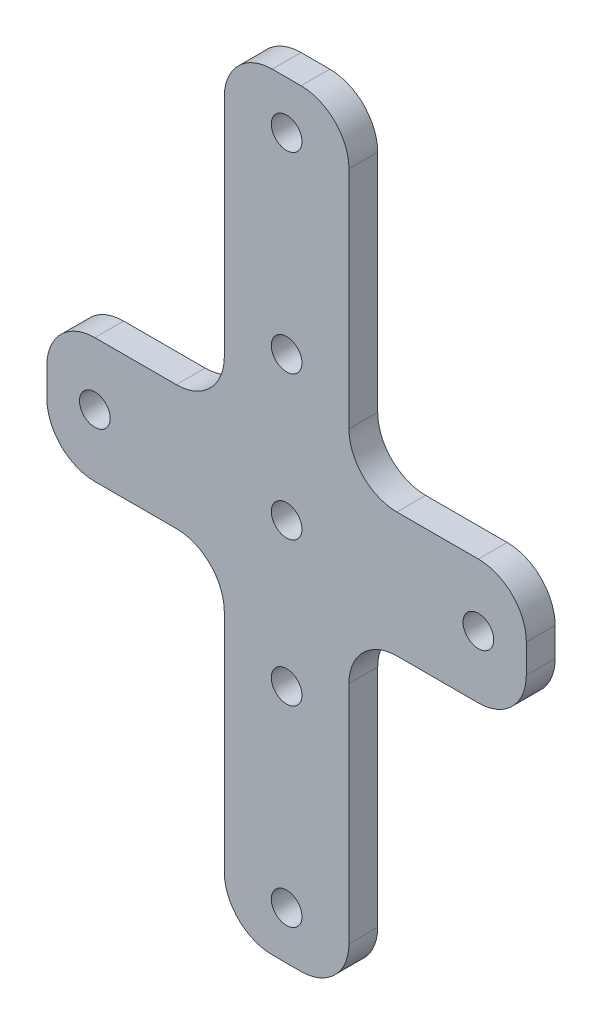
ISO-10303-21;
HEADER;
FILE_DESCRIPTION(('STEP AP214'),'2;1');
FILE_NAME('part.step','',(''),(''),'','','');
FILE_SCHEMA(('AUTOMOTIVE_DESIGN { 1 0 10303 214 1 1 1 1 }'));
ENDSEC;
DATA;
#1=APPLICATION_CONTEXT('core data for automotive mechanical design processes');
#2=APPLICATION_PROTOCOL_DEFINITION('international standard','automotive_design',2000,#1);
#3=PRODUCT_CONTEXT('',#1,'mechanical');
#4=PRODUCT('Part','Part','',(#3));
#5=PRODUCT_RELATED_PRODUCT_CATEGORY('part','',(#4));
#6=PRODUCT_DEFINITION_FORMATION('','',#4);
#7=PRODUCT_DEFINITION_CONTEXT('part definition',#1,'design');
#8=PRODUCT_DEFINITION('design','',#6,#7);
#9=PRODUCT_DEFINITION_SHAPE('','',#8);
#10=(LENGTH_UNIT() NAMED_UNIT(*) SI_UNIT(.MILLI.,.METRE.));
#11=(NAMED_UNIT(*) PLANE_ANGLE_UNIT() SI_UNIT($,.RADIAN.));
#12=(NAMED_UNIT(*) SI_UNIT($,.STERADIAN.) SOLID_ANGLE_UNIT());
#13=UNCERTAINTY_MEASURE_WITH_UNIT(LENGTH_MEASURE(1.E-05),#10,'distance_accuracy_value','');
#14=(GEOMETRIC_REPRESENTATION_CONTEXT(3) GLOBAL_UNCERTAINTY_ASSIGNED_CONTEXT((#13)) GLOBAL_UNIT_ASSIGNED_CONTEXT((#10,
#11,#12)) REPRESENTATION_CONTEXT('',''));
#15=CARTESIAN_POINT('',(0.,0.,0.));
#16=DIRECTION('',(0.,0.,1.));
#17=DIRECTION('',(1.,0.,0.));
#18=AXIS2_PLACEMENT_3D('',#15,#16,#17);
#19=CARTESIAN_POINT('',(-25.,-6.50000000000001,3.));
#20=DIRECTION('',(0.,1.,0.));
#21=DIRECTION('',(0.,0.,1.));
#22=AXIS2_PLACEMENT_3D('',#19,#20,#21);
#23=PLANE('',#22);
#24=DIRECTION('',(0.,0.,-1.));
#25=VECTOR('',#24,1.);
#26=CARTESIAN_POINT('',(11.5,-6.5,3.));
#27=LINE('',#26,#25);
#28=CARTESIAN_POINT('',(11.5,-6.50000000000001,0.));
#29=VERTEX_POINT('',#28);
#30=CARTESIAN_POINT('',(11.5,-6.5,3.));
#31=VERTEX_POINT('',#30);
#32=EDGE_CURVE('E69',#29,#31,#27,.F.);
#33=ORIENTED_EDGE('',*,*,#32,.F.);
#34=DIRECTION('',(1.,0.,0.));
#35=VECTOR('',#34,1.);
#36=CARTESIAN_POINT('',(-25.,-6.50000000000001,0.));
#37=LINE('',#36,#35);
#38=CARTESIAN_POINT('',(20.,-6.50000000000001,0.));
#39=VERTEX_POINT('',#38);
#40=EDGE_CURVE('E382',#29,#39,#37,.T.);
#41=ORIENTED_EDGE('',*,*,#40,.T.);
#42=DIRECTION('',(0.,0.,-1.));
#43=VECTOR('',#42,1.);
#44=CARTESIAN_POINT('',(20.,-6.50000000000001,3.));
#45=LINE('',#44,#43);
#46=CARTESIAN_POINT('',(20.,-6.50000000000001,3.));
#47=VERTEX_POINT('',#46);
#48=EDGE_CURVE('E476',#39,#47,#45,.F.);
#49=ORIENTED_EDGE('',*,*,#48,.T.);
#50=DIRECTION('',(1.,0.,0.));
#51=VECTOR('',#50,1.);
#52=CARTESIAN_POINT('',(-25.,-6.50000000000001,3.));
#53=LINE('',#52,#51);
#54=EDGE_CURVE('E350',#31,#47,#53,.T.);
#55=ORIENTED_EDGE('',*,*,#54,.F.);
#56=EDGE_LOOP('',(#33,#41,#49,#55));
#57=FACE_BOUND('',#56,.T.);
#58=ADVANCED_FACE('F45',(#57),#23,.F.);
#59=CARTESIAN_POINT('',(0.,0.,3.));
#60=DIRECTION('',(0.,0.,-1.));
#61=DIRECTION('',(-1.,0.,0.));
#62=AXIS2_PLACEMENT_3D('',#59,#60,#61);
#63=PLANE('',#62);
#64=DIRECTION('',(-1.,0.,0.));
#65=VECTOR('',#64,1.);
#66=CARTESIAN_POINT('',(25.,6.5,3.));
#67=LINE('',#66,#65);
#68=CARTESIAN_POINT('',(20.,6.5,3.));
#69=VERTEX_POINT('',#68);
#70=CARTESIAN_POINT('',(11.5,6.5,3.));
#71=VERTEX_POINT('',#70);
#72=EDGE_CURVE('E358',#69,#71,#67,.T.);
#73=ORIENTED_EDGE('',*,*,#72,.T.);
#74=CARTESIAN_POINT('',(11.5,11.5,3.));
#75=DIRECTION('',(0.,0.,-1.));
#76=DIRECTION('',(-1.,0.,0.));
#77=AXIS2_PLACEMENT_3D('',#74,#75,#76);
#78=CIRCLE('',#77,5.);
#79=CARTESIAN_POINT('',(6.5,11.5,3.));
#80=VERTEX_POINT('',#79);
#81=EDGE_CURVE('E11',#71,#80,#78,.T.);
#82=ORIENTED_EDGE('',*,*,#81,.T.);
#83=DIRECTION('',(0.,1.,0.));
#84=VECTOR('',#83,1.);
#85=CARTESIAN_POINT('',(6.5,6.5,3.));
#86=LINE('',#85,#84);
#87=CARTESIAN_POINT('',(6.5,35.,3.));
#88=VERTEX_POINT('',#87);
#89=EDGE_CURVE('E362',#80,#88,#86,.T.);
#90=ORIENTED_EDGE('',*,*,#89,.T.);
#91=CARTESIAN_POINT('',(1.5,35.,3.));
#92=DIRECTION('',(0.,0.,-1.));
#93=DIRECTION('',(-1.,0.,0.));
#94=AXIS2_PLACEMENT_3D('',#91,#92,#93);
#95=CIRCLE('',#94,5.);
#96=CARTESIAN_POINT('',(1.5,40.,3.));
#97=VERTEX_POINT('',#96);
#98=EDGE_CURVE('E445',#88,#97,#95,.F.);
#99=ORIENTED_EDGE('',*,*,#98,.T.);
#100=DIRECTION('',(-1.,0.,0.));
#101=VECTOR('',#100,1.);
#102=CARTESIAN_POINT('',(6.5,40.,3.));
#103=LINE('',#102,#101);
#104=CARTESIAN_POINT('',(-1.5,40.,3.));
#105=VERTEX_POINT('',#104);
#106=EDGE_CURVE('E366',#97,#105,#103,.T.);
#107=ORIENTED_EDGE('',*,*,#106,.T.);
#108=CARTESIAN_POINT('',(-1.5,35.,3.));
#109=DIRECTION('',(0.,0.,-1.));
#110=DIRECTION('',(-1.,0.,0.));
#111=AXIS2_PLACEMENT_3D('',#108,#109,#110);
#112=CIRCLE('',#111,5.);
#113=CARTESIAN_POINT('',(-6.5,35.,3.));
#114=VERTEX_POINT('',#113);
#115=EDGE_CURVE('E448',#105,#114,#112,.F.);
#116=ORIENTED_EDGE('',*,*,#115,.T.);
#117=DIRECTION('',(0.,-1.,0.));
#118=VECTOR('',#117,1.);
#119=CARTESIAN_POINT('',(-6.5,40.,3.));
#120=LINE('',#119,#118);
#121=CARTESIAN_POINT('',(-6.5,11.5,3.));
#122=VERTEX_POINT('',#121);
#123=EDGE_CURVE('E337',#114,#122,#120,.T.);
#124=ORIENTED_EDGE('',*,*,#123,.T.);
#125=CARTESIAN_POINT('',(-11.5,11.5,3.));
#126=DIRECTION('',(0.,0.,-1.));
#127=DIRECTION('',(-1.,0.,0.));
#128=AXIS2_PLACEMENT_3D('',#125,#126,#127);
#129=CIRCLE('',#128,5.);
#130=CARTESIAN_POINT('',(-11.5,6.5,3.));
#131=VERTEX_POINT('',#130);
#132=EDGE_CURVE('E497',#122,#131,#129,.T.);
#133=ORIENTED_EDGE('',*,*,#132,.T.);
#134=DIRECTION('',(-1.,0.,0.));
#135=VECTOR('',#134,1.);
#136=CARTESIAN_POINT('',(-6.5,6.5,3.));
#137=LINE('',#136,#135);
#138=CARTESIAN_POINT('',(-20.,6.49999999999999,3.));
#139=VERTEX_POINT('',#138);
#140=EDGE_CURVE('E341',#131,#139,#137,.T.);
#141=ORIENTED_EDGE('',*,*,#140,.T.);
#142=CARTESIAN_POINT('',(-20.,1.49999999999999,3.));
#143=DIRECTION('',(0.,0.,-1.));
#144=DIRECTION('',(-1.,0.,0.));
#145=AXIS2_PLACEMENT_3D('',#142,#143,#144);
#146=CIRCLE('',#145,5.);
#147=CARTESIAN_POINT('',(-25.,1.49999999999999,3.));
#148=VERTEX_POINT('',#147);
#149=EDGE_CURVE('E433',#139,#148,#146,.F.);
#150=ORIENTED_EDGE('',*,*,#149,.T.);
#151=DIRECTION('',(0.,-1.,0.));
#152=VECTOR('',#151,1.);
#153=CARTESIAN_POINT('',(-25.,6.49999999999999,3.));
#154=LINE('',#153,#152);
#155=CARTESIAN_POINT('',(-25.,-1.5,3.));
#156=VERTEX_POINT('',#155);
#157=EDGE_CURVE('E346',#148,#156,#154,.T.);
#158=ORIENTED_EDGE('',*,*,#157,.T.);
#159=CARTESIAN_POINT('',(-20.,-1.5,3.));
#160=DIRECTION('',(0.,0.,-1.));
#161=DIRECTION('',(-1.,0.,0.));
#162=AXIS2_PLACEMENT_3D('',#159,#160,#161);
#163=CIRCLE('',#162,5.);
#164=CARTESIAN_POINT('',(-20.,-6.50000000000001,3.));
#165=VERTEX_POINT('',#164);
#166=EDGE_CURVE('E436',#156,#165,#163,.F.);
#167=ORIENTED_EDGE('',*,*,#166,.T.);
#168=CARTESIAN_POINT('',(-11.5,-6.50000000000001,3.));
#169=VERTEX_POINT('',#168);
#170=EDGE_CURVE('E351',#165,#169,#53,.T.);
#171=ORIENTED_EDGE('',*,*,#170,.T.);
#172=CARTESIAN_POINT('',(-11.5,-11.5,3.));
#173=DIRECTION('',(0.,0.,1.));
#174=DIRECTION('',(-1.,0.,0.));
#175=AXIS2_PLACEMENT_3D('',#172,#173,#174);
#176=CIRCLE('',#175,5.);
#177=CARTESIAN_POINT('',(-6.5,-11.5,3.));
#178=VERTEX_POINT('',#177);
#179=EDGE_CURVE('E284',#178,#169,#176,.T.);
#180=ORIENTED_EDGE('',*,*,#179,.F.);
#181=DIRECTION('',(0.,1.,0.));
#182=VECTOR('',#181,1.);
#183=CARTESIAN_POINT('',(-6.5,-40.,3.));
#184=LINE('',#183,#182);
#185=CARTESIAN_POINT('',(-6.5,-35.,3.));
#186=VERTEX_POINT('',#185);
#187=EDGE_CURVE('E254',#186,#178,#184,.T.);
#188=ORIENTED_EDGE('',*,*,#187,.F.);
#189=CARTESIAN_POINT('',(-1.5,-35.,3.));
#190=DIRECTION('',(0.,0.,1.));
#191=DIRECTION('',(-1.,0.,0.));
#192=AXIS2_PLACEMENT_3D('',#189,#190,#191);
#193=CIRCLE('',#192,5.);
#194=CARTESIAN_POINT('',(-1.5,-40.,3.));
#195=VERTEX_POINT('',#194);
#196=EDGE_CURVE('E213',#195,#186,#193,.F.);
#197=ORIENTED_EDGE('',*,*,#196,.F.);
#198=DIRECTION('',(-1.,0.,0.));
#199=VECTOR('',#198,1.);
#200=CARTESIAN_POINT('',(6.5,-40.,3.));
#201=LINE('',#200,#199);
#202=CARTESIAN_POINT('',(1.5,-40.,3.));
#203=VERTEX_POINT('',#202);
#204=EDGE_CURVE('E249',#203,#195,#201,.T.);
#205=ORIENTED_EDGE('',*,*,#204,.F.);
#206=CARTESIAN_POINT('',(1.5,-35.,3.));
#207=DIRECTION('',(0.,0.,1.));
#208=DIRECTION('',(-1.,0.,0.));
#209=AXIS2_PLACEMENT_3D('',#206,#207,#208);
#210=CIRCLE('',#209,5.);
#211=CARTESIAN_POINT('',(6.5,-35.,3.));
#212=VERTEX_POINT('',#211);
#213=EDGE_CURVE('E265',#212,#203,#210,.F.);
#214=ORIENTED_EDGE('',*,*,#213,.F.);
#215=DIRECTION('',(0.,-1.,0.));
#216=VECTOR('',#215,1.);
#217=CARTESIAN_POINT('',(6.5,-6.5,3.));
#218=LINE('',#217,#216);
#219=CARTESIAN_POINT('',(6.5,-11.5,3.));
#220=VERTEX_POINT('',#219);
#221=EDGE_CURVE('E564',#220,#212,#218,.T.);
#222=ORIENTED_EDGE('',*,*,#221,.F.);
#223=CARTESIAN_POINT('',(11.5,-11.5,3.));
#224=DIRECTION('',(0.,0.,1.));
#225=DIRECTION('',(-1.,0.,0.));
#226=AXIS2_PLACEMENT_3D('',#223,#224,#225);
#227=CIRCLE('',#226,5.);
#228=EDGE_CURVE('E292',#31,#220,#227,.T.);
#229=ORIENTED_EDGE('',*,*,#228,.F.);
#230=ORIENTED_EDGE('',*,*,#54,.T.);
#231=CARTESIAN_POINT('',(20.,-1.5,3.));
#232=DIRECTION('',(0.,0.,-1.));
#233=DIRECTION('',(-1.,0.,0.));
#234=AXIS2_PLACEMENT_3D('',#231,#232,#233);
#235=CIRCLE('',#234,5.);
#236=CARTESIAN_POINT('',(25.,-1.50000000000001,3.));
#237=VERTEX_POINT('',#236);
#238=EDGE_CURVE('E439',#47,#237,#235,.F.);
#239=ORIENTED_EDGE('',*,*,#238,.T.);
#240=DIRECTION('',(0.,1.,0.));
#241=VECTOR('',#240,1.);
#242=CARTESIAN_POINT('',(25.,-6.50000000000001,3.));
#243=LINE('',#242,#241);
#244=CARTESIAN_POINT('',(25.,1.5,3.));
#245=VERTEX_POINT('',#244);
#246=EDGE_CURVE('E354',#237,#245,#243,.T.);
#247=ORIENTED_EDGE('',*,*,#246,.T.);
#248=CARTESIAN_POINT('',(20.,1.5,3.));
#249=DIRECTION('',(0.,0.,-1.));
#250=DIRECTION('',(-1.,0.,0.));
#251=AXIS2_PLACEMENT_3D('',#248,#249,#250);
#252=CIRCLE('',#251,5.);
#253=EDGE_CURVE('E442',#245,#69,#252,.F.);
#254=ORIENTED_EDGE('',*,*,#253,.T.);
#255=EDGE_LOOP('',(#73,#82,#90,#99,#107,#116,#124,#133,#141,#150,#158,#167,#171,#180,#188,#197,
#205,#214,#222,#229,#230,#239,#247,#254));
#256=FACE_BOUND('',#255,.T.);
#257=CARTESIAN_POINT('',(0.,0.,3.));
#258=DIRECTION('',(0.,0.,1.));
#259=DIRECTION('',(1.,0.,0.));
#260=AXIS2_PLACEMENT_3D('',#257,#258,#259);
#261=CIRCLE('',#260,1.6);
#262=CARTESIAN_POINT('',(1.6,0.,3.));
#263=VERTEX_POINT('',#262);
#264=EDGE_CURVE('E313',#263,#263,#261,.T.);
#265=ORIENTED_EDGE('',*,*,#264,.F.);
#266=EDGE_LOOP('',(#265));
#267=FACE_BOUND('',#266,.T.);
#268=CARTESIAN_POINT('',(20.,0.,3.));
#269=DIRECTION('',(0.,0.,1.));
#270=DIRECTION('',(1.,0.,0.));
#271=AXIS2_PLACEMENT_3D('',#268,#269,#270);
#272=CIRCLE('',#271,1.6);
#273=CARTESIAN_POINT('',(21.6,0.,3.));
#274=VERTEX_POINT('',#273);
#275=EDGE_CURVE('E305',#274,#274,#272,.T.);
#276=ORIENTED_EDGE('',*,*,#275,.F.);
#277=EDGE_LOOP('',(#276));
#278=FACE_BOUND('',#277,.T.);
#279=CARTESIAN_POINT('',(-20.,0.,3.));
#280=DIRECTION('',(0.,0.,1.));
#281=DIRECTION('',(1.,0.,0.));
#282=AXIS2_PLACEMENT_3D('',#279,#280,#281);
#283=CIRCLE('',#282,1.6);
#284=CARTESIAN_POINT('',(-18.4,0.,3.));
#285=VERTEX_POINT('',#284);
#286=EDGE_CURVE('E297',#285,#285,#283,.T.);
#287=ORIENTED_EDGE('',*,*,#286,.F.);
#288=EDGE_LOOP('',(#287));
#289=FACE_BOUND('',#288,.T.);
#290=CARTESIAN_POINT('',(0.,-15.,3.));
#291=DIRECTION('',(0.,0.,-1.));
#292=DIRECTION('',(1.,0.,0.));
#293=AXIS2_PLACEMENT_3D('',#290,#291,#292);
#294=CIRCLE('',#293,1.6);
#295=CARTESIAN_POINT('',(1.6,-15.,3.));
#296=VERTEX_POINT('',#295);
#297=EDGE_CURVE('E571',#296,#296,#294,.T.);
#298=ORIENTED_EDGE('',*,*,#297,.T.);
#299=EDGE_LOOP('',(#298));
#300=FACE_BOUND('',#299,.T.);
#301=CARTESIAN_POINT('',(0.,-35.,3.));
#302=DIRECTION('',(0.,0.,-1.));
#303=DIRECTION('',(1.,0.,0.));
#304=AXIS2_PLACEMENT_3D('',#301,#302,#303);
#305=CIRCLE('',#304,1.6);
#306=CARTESIAN_POINT('',(1.6,-35.,3.));
#307=VERTEX_POINT('',#306);
#308=EDGE_CURVE('E239',#307,#307,#305,.T.);
#309=ORIENTED_EDGE('',*,*,#308,.T.);
#310=EDGE_LOOP('',(#309));
#311=FACE_BOUND('',#310,.T.);
#312=CARTESIAN_POINT('',(0.,15.,3.));
#313=DIRECTION('',(0.,0.,1.));
#314=DIRECTION('',(1.,0.,0.));
#315=AXIS2_PLACEMENT_3D('',#312,#313,#314);
#316=CIRCLE('',#315,1.6);
#317=CARTESIAN_POINT('',(1.6,15.,3.));
#318=VERTEX_POINT('',#317);
#319=EDGE_CURVE('E321',#318,#318,#316,.T.);
#320=ORIENTED_EDGE('',*,*,#319,.F.);
#321=EDGE_LOOP('',(#320));
#322=FACE_BOUND('',#321,.T.);
#323=CARTESIAN_POINT('',(0.,35.,3.));
#324=DIRECTION('',(0.,0.,1.));
#325=DIRECTION('',(1.,0.,0.));
#326=AXIS2_PLACEMENT_3D('',#323,#324,#325);
#327=CIRCLE('',#326,1.6);
#328=CARTESIAN_POINT('',(1.6,35.,3.));
#329=VERTEX_POINT('',#328);
#330=EDGE_CURVE('E329',#329,#329,#327,.T.);
#331=ORIENTED_EDGE('',*,*,#330,.F.);
#332=EDGE_LOOP('',(#331));
#333=FACE_BOUND('',#332,.T.);
#334=ADVANCED_FACE('F512',(#256,#267,#278,#289,#300,#311,#322,#333),#63,.F.);
#335=CARTESIAN_POINT('',(0.,0.,0.));
#336=DIRECTION('',(0.,0.,-1.));
#337=DIRECTION('',(-1.,0.,0.));
#338=AXIS2_PLACEMENT_3D('',#335,#336,#337);
#339=PLANE('',#338);
#340=DIRECTION('',(-1.,0.,0.));
#341=VECTOR('',#340,1.);
#342=CARTESIAN_POINT('',(-6.5,6.5,0.));
#343=LINE('',#342,#341);
#344=CARTESIAN_POINT('',(-11.5,6.5,0.));
#345=VERTEX_POINT('',#344);
#346=CARTESIAN_POINT('',(-20.,6.49999999999999,0.));
#347=VERTEX_POINT('',#346);
#348=EDGE_CURVE('E374',#345,#347,#343,.T.);
#349=ORIENTED_EDGE('',*,*,#348,.F.);
#350=CARTESIAN_POINT('',(-11.5,11.5,0.));
#351=DIRECTION('',(0.,0.,-1.));
#352=DIRECTION('',(-1.,0.,0.));
#353=AXIS2_PLACEMENT_3D('',#350,#351,#352);
#354=CIRCLE('',#353,5.);
#355=CARTESIAN_POINT('',(-6.5,11.5,0.));
#356=VERTEX_POINT('',#355);
#357=EDGE_CURVE('E494',#345,#356,#354,.F.);
#358=ORIENTED_EDGE('',*,*,#357,.T.);
#359=DIRECTION('',(0.,-1.,0.));
#360=VECTOR('',#359,1.);
#361=CARTESIAN_POINT('',(-6.5,40.,0.));
#362=LINE('',#361,#360);
#363=CARTESIAN_POINT('',(-6.5,35.,0.));
#364=VERTEX_POINT('',#363);
#365=EDGE_CURVE('E333',#364,#356,#362,.T.);
#366=ORIENTED_EDGE('',*,*,#365,.F.);
#367=CARTESIAN_POINT('',(-1.5,35.,0.));
#368=DIRECTION('',(0.,0.,-1.));
#369=DIRECTION('',(-1.,0.,0.));
#370=AXIS2_PLACEMENT_3D('',#367,#368,#369);
#371=CIRCLE('',#370,5.);
#372=CARTESIAN_POINT('',(-1.5,40.,0.));
#373=VERTEX_POINT('',#372);
#374=EDGE_CURVE('E423',#364,#373,#371,.T.);
#375=ORIENTED_EDGE('',*,*,#374,.T.);
#376=DIRECTION('',(-1.,0.,0.));
#377=VECTOR('',#376,1.);
#378=CARTESIAN_POINT('',(6.5,40.,0.));
#379=LINE('',#378,#377);
#380=CARTESIAN_POINT('',(1.5,40.,0.));
#381=VERTEX_POINT('',#380);
#382=EDGE_CURVE('E342',#381,#373,#379,.T.);
#383=ORIENTED_EDGE('',*,*,#382,.F.);
#384=CARTESIAN_POINT('',(1.5,35.,0.));
#385=DIRECTION('',(0.,0.,-1.));
#386=DIRECTION('',(-1.,0.,0.));
#387=AXIS2_PLACEMENT_3D('',#384,#385,#386);
#388=CIRCLE('',#387,5.);
#389=CARTESIAN_POINT('',(6.5,35.,0.));
#390=VERTEX_POINT('',#389);
#391=EDGE_CURVE('E420',#381,#390,#388,.T.);
#392=ORIENTED_EDGE('',*,*,#391,.T.);
#393=DIRECTION('',(0.,1.,0.));
#394=VECTOR('',#393,1.);
#395=CARTESIAN_POINT('',(6.5,6.5,0.));
#396=LINE('',#395,#394);
#397=CARTESIAN_POINT('',(6.5,11.5,0.));
#398=VERTEX_POINT('',#397);
#399=EDGE_CURVE('E394',#398,#390,#396,.T.);
#400=ORIENTED_EDGE('',*,*,#399,.F.);
#401=CARTESIAN_POINT('',(11.5,11.5,0.));
#402=DIRECTION('',(0.,0.,-1.));
#403=DIRECTION('',(-1.,0.,0.));
#404=AXIS2_PLACEMENT_3D('',#401,#402,#403);
#405=CIRCLE('',#404,5.);
#406=CARTESIAN_POINT('',(11.5,6.5,0.));
#407=VERTEX_POINT('',#406);
#408=EDGE_CURVE('E54',#398,#407,#405,.F.);
#409=ORIENTED_EDGE('',*,*,#408,.T.);
#410=DIRECTION('',(-1.,0.,0.));
#411=VECTOR('',#410,1.);
#412=CARTESIAN_POINT('',(25.,6.5,0.));
#413=LINE('',#412,#411);
#414=CARTESIAN_POINT('',(20.,6.5,0.));
#415=VERTEX_POINT('',#414);
#416=EDGE_CURVE('E390',#415,#407,#413,.T.);
#417=ORIENTED_EDGE('',*,*,#416,.F.);
#418=CARTESIAN_POINT('',(20.,1.5,0.));
#419=DIRECTION('',(0.,0.,-1.));
#420=DIRECTION('',(-1.,0.,0.));
#421=AXIS2_PLACEMENT_3D('',#418,#419,#420);
#422=CIRCLE('',#421,5.);
#423=CARTESIAN_POINT('',(25.,1.5,0.));
#424=VERTEX_POINT('',#423);
#425=EDGE_CURVE('E417',#415,#424,#422,.T.);
#426=ORIENTED_EDGE('',*,*,#425,.T.);
#427=DIRECTION('',(0.,1.,0.));
#428=VECTOR('',#427,1.);
#429=CARTESIAN_POINT('',(25.,-6.50000000000001,0.));
#430=LINE('',#429,#428);
#431=CARTESIAN_POINT('',(25.,-1.50000000000001,0.));
#432=VERTEX_POINT('',#431);
#433=EDGE_CURVE('E386',#432,#424,#430,.T.);
#434=ORIENTED_EDGE('',*,*,#433,.F.);
#435=CARTESIAN_POINT('',(20.,-1.5,0.));
#436=DIRECTION('',(0.,0.,-1.));
#437=DIRECTION('',(-1.,0.,0.));
#438=AXIS2_PLACEMENT_3D('',#435,#436,#437);
#439=CIRCLE('',#438,5.);
#440=EDGE_CURVE('E413',#432,#39,#439,.T.);
#441=ORIENTED_EDGE('',*,*,#440,.T.);
#442=ORIENTED_EDGE('',*,*,#40,.F.);
#443=CARTESIAN_POINT('',(11.5,-11.5,0.));
#444=DIRECTION('',(0.,0.,1.));
#445=DIRECTION('',(-1.,0.,0.));
#446=AXIS2_PLACEMENT_3D('',#443,#444,#445);
#447=CIRCLE('',#446,5.);
#448=CARTESIAN_POINT('',(6.5,-11.5,0.));
#449=VERTEX_POINT('',#448);
#450=EDGE_CURVE('E288',#449,#29,#447,.F.);
#451=ORIENTED_EDGE('',*,*,#450,.F.);
#452=DIRECTION('',(0.,-1.,0.));
#453=VECTOR('',#452,1.);
#454=CARTESIAN_POINT('',(6.5,-6.5,0.));
#455=LINE('',#454,#453);
#456=CARTESIAN_POINT('',(6.5,-35.,0.));
#457=VERTEX_POINT('',#456);
#458=EDGE_CURVE('E238',#449,#457,#455,.T.);
#459=ORIENTED_EDGE('',*,*,#458,.T.);
#460=CARTESIAN_POINT('',(1.5,-35.,0.));
#461=DIRECTION('',(0.,0.,1.));
#462=DIRECTION('',(-1.,0.,0.));
#463=AXIS2_PLACEMENT_3D('',#460,#461,#462);
#464=CIRCLE('',#463,5.);
#465=CARTESIAN_POINT('',(1.5,-40.,0.));
#466=VERTEX_POINT('',#465);
#467=EDGE_CURVE('E219',#466,#457,#464,.T.);
#468=ORIENTED_EDGE('',*,*,#467,.F.);
#469=DIRECTION('',(-1.,0.,0.));
#470=VECTOR('',#469,1.);
#471=CARTESIAN_POINT('',(6.5,-40.,0.));
#472=LINE('',#471,#470);
#473=CARTESIAN_POINT('',(-1.5,-40.,0.));
#474=VERTEX_POINT('',#473);
#475=EDGE_CURVE('E231',#466,#474,#472,.T.);
#476=ORIENTED_EDGE('',*,*,#475,.T.);
#477=CARTESIAN_POINT('',(-1.5,-35.,0.));
#478=DIRECTION('',(0.,0.,1.));
#479=DIRECTION('',(-1.,0.,0.));
#480=AXIS2_PLACEMENT_3D('',#477,#478,#479);
#481=CIRCLE('',#480,5.);
#482=CARTESIAN_POINT('',(-6.5,-35.,0.));
#483=VERTEX_POINT('',#482);
#484=EDGE_CURVE('E210',#483,#474,#481,.T.);
#485=ORIENTED_EDGE('',*,*,#484,.F.);
#486=DIRECTION('',(0.,1.,0.));
#487=VECTOR('',#486,1.);
#488=CARTESIAN_POINT('',(-6.5,-40.,0.));
#489=LINE('',#488,#487);
#490=CARTESIAN_POINT('',(-6.5,-11.5,0.));
#491=VERTEX_POINT('',#490);
#492=EDGE_CURVE('E228',#483,#491,#489,.T.);
#493=ORIENTED_EDGE('',*,*,#492,.T.);
#494=CARTESIAN_POINT('',(-11.5,-11.5,0.));
#495=DIRECTION('',(0.,0.,1.));
#496=DIRECTION('',(-1.,0.,0.));
#497=AXIS2_PLACEMENT_3D('',#494,#495,#496);
#498=CIRCLE('',#497,5.);
#499=CARTESIAN_POINT('',(-11.5,-6.50000000000001,0.));
#500=VERTEX_POINT('',#499);
#501=EDGE_CURVE('E281',#500,#491,#498,.F.);
#502=ORIENTED_EDGE('',*,*,#501,.F.);
#503=CARTESIAN_POINT('',(-20.,-6.50000000000001,0.));
#504=VERTEX_POINT('',#503);
#505=EDGE_CURVE('E383',#504,#500,#37,.T.);
#506=ORIENTED_EDGE('',*,*,#505,.F.);
#507=CARTESIAN_POINT('',(-20.,-1.5,0.));
#508=DIRECTION('',(0.,0.,-1.));
#509=DIRECTION('',(-1.,0.,0.));
#510=AXIS2_PLACEMENT_3D('',#507,#508,#509);
#511=CIRCLE('',#510,5.);
#512=CARTESIAN_POINT('',(-25.,-1.5,0.));
#513=VERTEX_POINT('',#512);
#514=EDGE_CURVE('E410',#504,#513,#511,.T.);
#515=ORIENTED_EDGE('',*,*,#514,.T.);
#516=DIRECTION('',(0.,-1.,0.));
#517=VECTOR('',#516,1.);
#518=CARTESIAN_POINT('',(-25.,6.49999999999999,0.));
#519=LINE('',#518,#517);
#520=CARTESIAN_POINT('',(-25.,1.49999999999999,0.));
#521=VERTEX_POINT('',#520);
#522=EDGE_CURVE('E378',#521,#513,#519,.T.);
#523=ORIENTED_EDGE('',*,*,#522,.F.);
#524=CARTESIAN_POINT('',(-20.,1.49999999999999,0.));
#525=DIRECTION('',(0.,0.,-1.));
#526=DIRECTION('',(-1.,0.,0.));
#527=AXIS2_PLACEMENT_3D('',#524,#525,#526);
#528=CIRCLE('',#527,5.);
#529=EDGE_CURVE('E407',#521,#347,#528,.T.);
#530=ORIENTED_EDGE('',*,*,#529,.T.);
#531=EDGE_LOOP('',(#349,#358,#366,#375,#383,#392,#400,#409,#417,#426,#434,#441,#442,#451,#459,
#468,#476,#485,#493,#502,#506,#515,#523,#530));
#532=FACE_BOUND('',#531,.T.);
#533=CARTESIAN_POINT('',(20.,0.,0.));
#534=DIRECTION('',(0.,0.,1.));
#535=DIRECTION('',(1.,0.,0.));
#536=AXIS2_PLACEMENT_3D('',#533,#534,#535);
#537=CIRCLE('',#536,1.6);
#538=CARTESIAN_POINT('',(21.6,0.,0.));
#539=VERTEX_POINT('',#538);
#540=EDGE_CURVE('E301',#539,#539,#537,.T.);
#541=ORIENTED_EDGE('',*,*,#540,.T.);
#542=EDGE_LOOP('',(#541));
#543=FACE_BOUND('',#542,.T.);
#544=CARTESIAN_POINT('',(0.,0.,0.));
#545=DIRECTION('',(0.,0.,1.));
#546=DIRECTION('',(1.,0.,0.));
#547=AXIS2_PLACEMENT_3D('',#544,#545,#546);
#548=CIRCLE('',#547,1.6);
#549=CARTESIAN_POINT('',(1.6,0.,0.));
#550=VERTEX_POINT('',#549);
#551=EDGE_CURVE('E309',#550,#550,#548,.T.);
#552=ORIENTED_EDGE('',*,*,#551,.T.);
#553=EDGE_LOOP('',(#552));
#554=FACE_BOUND('',#553,.T.);
#555=CARTESIAN_POINT('',(-20.,0.,0.));
#556=DIRECTION('',(0.,0.,1.));
#557=DIRECTION('',(1.,0.,0.));
#558=AXIS2_PLACEMENT_3D('',#555,#556,#557);
#559=CIRCLE('',#558,1.6);
#560=CARTESIAN_POINT('',(-18.4,0.,0.));
#561=VERTEX_POINT('',#560);
#562=EDGE_CURVE('E296',#561,#561,#559,.T.);
#563=ORIENTED_EDGE('',*,*,#562,.T.);
#564=EDGE_LOOP('',(#563));
#565=FACE_BOUND('',#564,.T.);
#566=CARTESIAN_POINT('',(0.,-35.,0.));
#567=DIRECTION('',(0.,0.,-1.));
#568=DIRECTION('',(1.,0.,0.));
#569=AXIS2_PLACEMENT_3D('',#566,#567,#568);
#570=CIRCLE('',#569,1.6);
#571=CARTESIAN_POINT('',(1.6,-35.,0.));
#572=VERTEX_POINT('',#571);
#573=EDGE_CURVE('E246',#572,#572,#570,.T.);
#574=ORIENTED_EDGE('',*,*,#573,.F.);
#575=EDGE_LOOP('',(#574));
#576=FACE_BOUND('',#575,.T.);
#577=CARTESIAN_POINT('',(0.,-15.,0.));
#578=DIRECTION('',(0.,0.,-1.));
#579=DIRECTION('',(1.,0.,0.));
#580=AXIS2_PLACEMENT_3D('',#577,#578,#579);
#581=CIRCLE('',#580,1.6);
#582=CARTESIAN_POINT('',(1.6,-15.,0.));
#583=VERTEX_POINT('',#582);
#584=EDGE_CURVE('E573',#583,#583,#581,.T.);
#585=ORIENTED_EDGE('',*,*,#584,.F.);
#586=EDGE_LOOP('',(#585));
#587=FACE_BOUND('',#586,.T.);
#588=CARTESIAN_POINT('',(0.,35.,0.));
#589=DIRECTION('',(0.,0.,1.));
#590=DIRECTION('',(1.,0.,0.));
#591=AXIS2_PLACEMENT_3D('',#588,#589,#590);
#592=CIRCLE('',#591,1.6);
#593=CARTESIAN_POINT('',(1.6,35.,0.));
#594=VERTEX_POINT('',#593);
#595=EDGE_CURVE('E325',#594,#594,#592,.T.);
#596=ORIENTED_EDGE('',*,*,#595,.T.);
#597=EDGE_LOOP('',(#596));
#598=FACE_BOUND('',#597,.T.);
#599=CARTESIAN_POINT('',(0.,15.,0.));
#600=DIRECTION('',(0.,0.,1.));
#601=DIRECTION('',(1.,0.,0.));
#602=AXIS2_PLACEMENT_3D('',#599,#600,#601);
#603=CIRCLE('',#602,1.6);
#604=CARTESIAN_POINT('',(1.6,15.,0.));
#605=VERTEX_POINT('',#604);
#606=EDGE_CURVE('E317',#605,#605,#603,.T.);
#607=ORIENTED_EDGE('',*,*,#606,.T.);
#608=EDGE_LOOP('',(#607));
#609=FACE_BOUND('',#608,.T.);
#610=ADVANCED_FACE('F225',(#532,#543,#554,#565,#576,#587,#598,#609),#339,.T.);
#611=CARTESIAN_POINT('',(-6.5,40.,3.));
#612=DIRECTION('',(1.,0.,0.));
#613=DIRECTION('',(0.,1.,0.));
#614=AXIS2_PLACEMENT_3D('',#611,#612,#613);
#615=PLANE('',#614);
#616=ORIENTED_EDGE('',*,*,#123,.F.);
#617=DIRECTION('',(0.,0.,-1.));
#618=VECTOR('',#617,1.);
#619=CARTESIAN_POINT('',(-6.5,35.,3.));
#620=LINE('',#619,#618);
#621=EDGE_CURVE('E403',#114,#364,#620,.T.);
#622=ORIENTED_EDGE('',*,*,#621,.T.);
#623=ORIENTED_EDGE('',*,*,#365,.T.);
#624=DIRECTION('',(0.,0.,-1.));
#625=VECTOR('',#624,1.);
#626=CARTESIAN_POINT('',(-6.5,11.5,3.));
#627=LINE('',#626,#625);
#628=EDGE_CURVE('E370',#356,#122,#627,.F.);
#629=ORIENTED_EDGE('',*,*,#628,.T.);
#630=EDGE_LOOP('',(#616,#622,#623,#629));
#631=FACE_BOUND('',#630,.T.);
#632=ADVANCED_FACE('F533',(#631),#615,.F.);
#633=CARTESIAN_POINT('',(-6.5,6.5,3.));
#634=DIRECTION('',(0.,-1.,0.));
#635=DIRECTION('',(1.,0.,0.));
#636=AXIS2_PLACEMENT_3D('',#633,#634,#635);
#637=PLANE('',#636);
#638=ORIENTED_EDGE('',*,*,#348,.T.);
#639=DIRECTION('',(0.,0.,-1.));
#640=VECTOR('',#639,1.);
#641=CARTESIAN_POINT('',(-20.,6.49999999999999,3.));
#642=LINE('',#641,#640);
#643=EDGE_CURVE('E491',#347,#139,#642,.F.);
#644=ORIENTED_EDGE('',*,*,#643,.T.);
#645=ORIENTED_EDGE('',*,*,#140,.F.);
#646=DIRECTION('',(0.,0.,-1.));
#647=VECTOR('',#646,1.);
#648=CARTESIAN_POINT('',(-11.5,6.5,0.));
#649=LINE('',#648,#647);
#650=EDGE_CURVE('E487',#131,#345,#649,.T.);
#651=ORIENTED_EDGE('',*,*,#650,.T.);
#652=EDGE_LOOP('',(#638,#644,#645,#651));
#653=FACE_BOUND('',#652,.T.);
#654=ADVANCED_FACE('F542',(#653),#637,.F.);
#655=CARTESIAN_POINT('',(-25.,6.49999999999999,3.));
#656=DIRECTION('',(1.,0.,0.));
#657=DIRECTION('',(0.,0.,-1.));
#658=AXIS2_PLACEMENT_3D('',#655,#656,#657);
#659=PLANE('',#658);
#660=ORIENTED_EDGE('',*,*,#522,.T.);
#661=DIRECTION('',(0.,0.,-1.));
#662=VECTOR('',#661,1.);
#663=CARTESIAN_POINT('',(-25.,-1.5,3.));
#664=LINE('',#663,#662);
#665=EDGE_CURVE('E484',#513,#156,#664,.F.);
#666=ORIENTED_EDGE('',*,*,#665,.T.);
#667=ORIENTED_EDGE('',*,*,#157,.F.);
#668=DIRECTION('',(0.,0.,-1.));
#669=VECTOR('',#668,1.);
#670=CARTESIAN_POINT('',(-25.,1.49999999999999,3.));
#671=LINE('',#670,#669);
#672=EDGE_CURVE('E480',#148,#521,#671,.T.);
#673=ORIENTED_EDGE('',*,*,#672,.T.);
#674=EDGE_LOOP('',(#660,#666,#667,#673));
#675=FACE_BOUND('',#674,.T.);
#676=ADVANCED_FACE('F550',(#675),#659,.F.);
#677=ORIENTED_EDGE('',*,*,#505,.T.);
#678=DIRECTION('',(0.,0.,-1.));
#679=VECTOR('',#678,1.);
#680=CARTESIAN_POINT('',(-11.5,-6.5,0.));
#681=LINE('',#680,#679);
#682=EDGE_CURVE('E61',#169,#500,#681,.T.);
#683=ORIENTED_EDGE('',*,*,#682,.F.);
#684=ORIENTED_EDGE('',*,*,#170,.F.);
#685=DIRECTION('',(0.,0.,-1.));
#686=VECTOR('',#685,1.);
#687=CARTESIAN_POINT('',(-20.,-6.50000000000001,3.));
#688=LINE('',#687,#686);
#689=EDGE_CURVE('E472',#165,#504,#688,.T.);
#690=ORIENTED_EDGE('',*,*,#689,.T.);
#691=EDGE_LOOP('',(#677,#683,#684,#690));
#692=FACE_BOUND('',#691,.T.);
#693=ADVANCED_FACE('F557',(#692),#23,.F.);
#694=CARTESIAN_POINT('',(25.,-6.50000000000001,3.));
#695=DIRECTION('',(-1.,0.,0.));
#696=DIRECTION('',(0.,0.,1.));
#697=AXIS2_PLACEMENT_3D('',#694,#695,#696);
#698=PLANE('',#697);
#699=ORIENTED_EDGE('',*,*,#433,.T.);
#700=DIRECTION('',(0.,0.,-1.));
#701=VECTOR('',#700,1.);
#702=CARTESIAN_POINT('',(25.,1.5,3.));
#703=LINE('',#702,#701);
#704=EDGE_CURVE('E469',#424,#245,#703,.F.);
#705=ORIENTED_EDGE('',*,*,#704,.T.);
#706=ORIENTED_EDGE('',*,*,#246,.F.);
#707=DIRECTION('',(0.,0.,-1.));
#708=VECTOR('',#707,1.);
#709=CARTESIAN_POINT('',(25.,-1.5,3.));
#710=LINE('',#709,#708);
#711=EDGE_CURVE('E465',#237,#432,#710,.T.);
#712=ORIENTED_EDGE('',*,*,#711,.T.);
#713=EDGE_LOOP('',(#699,#705,#706,#712));
#714=FACE_BOUND('',#713,.T.);
#715=ADVANCED_FACE('F622',(#714),#698,.F.);
#716=CARTESIAN_POINT('',(25.,6.5,3.));
#717=DIRECTION('',(0.,-1.,0.));
#718=DIRECTION('',(1.,0.,0.));
#719=AXIS2_PLACEMENT_3D('',#716,#717,#718);
#720=PLANE('',#719);
#721=ORIENTED_EDGE('',*,*,#72,.F.);
#722=DIRECTION('',(0.,0.,-1.));
#723=VECTOR('',#722,1.);
#724=CARTESIAN_POINT('',(20.,6.5,3.));
#725=LINE('',#724,#723);
#726=EDGE_CURVE('E461',#69,#415,#725,.T.);
#727=ORIENTED_EDGE('',*,*,#726,.T.);
#728=ORIENTED_EDGE('',*,*,#416,.T.);
#729=DIRECTION('',(0.,0.,-1.));
#730=VECTOR('',#729,1.);
#731=CARTESIAN_POINT('',(11.5,6.5,3.));
#732=LINE('',#731,#730);
#733=EDGE_CURVE('E458',#407,#71,#732,.F.);
#734=ORIENTED_EDGE('',*,*,#733,.T.);
#735=EDGE_LOOP('',(#721,#727,#728,#734));
#736=FACE_BOUND('',#735,.T.);
#737=ADVANCED_FACE('F507',(#736),#720,.F.);
#738=CARTESIAN_POINT('',(6.5,6.5,3.));
#739=DIRECTION('',(-1.,0.,0.));
#740=DIRECTION('',(0.,-1.,0.));
#741=AXIS2_PLACEMENT_3D('',#738,#739,#740);
#742=PLANE('',#741);
#743=ORIENTED_EDGE('',*,*,#399,.T.);
#744=DIRECTION('',(0.,0.,-1.));
#745=VECTOR('',#744,1.);
#746=CARTESIAN_POINT('',(6.5,35.,3.));
#747=LINE('',#746,#745);
#748=EDGE_CURVE('E455',#390,#88,#747,.F.);
#749=ORIENTED_EDGE('',*,*,#748,.T.);
#750=ORIENTED_EDGE('',*,*,#89,.F.);
#751=DIRECTION('',(0.,0.,-1.));
#752=VECTOR('',#751,1.);
#753=CARTESIAN_POINT('',(6.5,11.5,0.));
#754=LINE('',#753,#752);
#755=EDGE_CURVE('E451',#80,#398,#754,.T.);
#756=ORIENTED_EDGE('',*,*,#755,.T.);
#757=EDGE_LOOP('',(#743,#749,#750,#756));
#758=FACE_BOUND('',#757,.T.);
#759=ADVANCED_FACE('F516',(#758),#742,.F.);
#760=CARTESIAN_POINT('',(6.5,40.,3.));
#761=DIRECTION('',(0.,-1.,0.));
#762=DIRECTION('',(0.,0.,-1.));
#763=AXIS2_PLACEMENT_3D('',#760,#761,#762);
#764=PLANE('',#763);
#765=ORIENTED_EDGE('',*,*,#382,.T.);
#766=DIRECTION('',(0.,0.,-1.));
#767=VECTOR('',#766,1.);
#768=CARTESIAN_POINT('',(-1.5,40.,3.));
#769=LINE('',#768,#767);
#770=EDGE_CURVE('E430',#373,#105,#769,.F.);
#771=ORIENTED_EDGE('',*,*,#770,.T.);
#772=ORIENTED_EDGE('',*,*,#106,.F.);
#773=DIRECTION('',(0.,0.,-1.));
#774=VECTOR('',#773,1.);
#775=CARTESIAN_POINT('',(1.5,40.,3.));
#776=LINE('',#775,#774);
#777=EDGE_CURVE('E426',#97,#381,#776,.T.);
#778=ORIENTED_EDGE('',*,*,#777,.T.);
#779=EDGE_LOOP('',(#765,#771,#772,#778));
#780=FACE_BOUND('',#779,.T.);
#781=ADVANCED_FACE('F524',(#780),#764,.F.);
#782=CARTESIAN_POINT('',(0.,35.,3.));
#783=DIRECTION('',(0.,0.,-1.));
#784=DIRECTION('',(-1.,0.,0.));
#785=AXIS2_PLACEMENT_3D('',#782,#783,#784);
#786=CYLINDRICAL_SURFACE('',#785,1.6);
#787=ORIENTED_EDGE('',*,*,#330,.T.);
#788=EDGE_LOOP('',(#787));
#789=FACE_BOUND('',#788,.T.);
#790=ORIENTED_EDGE('',*,*,#595,.F.);
#791=EDGE_LOOP('',(#790));
#792=FACE_BOUND('',#791,.T.);
#793=ADVANCED_FACE('F600',(#789,#792),#786,.F.);
#794=CARTESIAN_POINT('',(0.,15.,3.));
#795=DIRECTION('',(0.,0.,-1.));
#796=DIRECTION('',(-1.,0.,0.));
#797=AXIS2_PLACEMENT_3D('',#794,#795,#796);
#798=CYLINDRICAL_SURFACE('',#797,1.6);
#799=ORIENTED_EDGE('',*,*,#319,.T.);
#800=EDGE_LOOP('',(#799));
#801=FACE_BOUND('',#800,.T.);
#802=ORIENTED_EDGE('',*,*,#606,.F.);
#803=EDGE_LOOP('',(#802));
#804=FACE_BOUND('',#803,.T.);
#805=ADVANCED_FACE('F597',(#801,#804),#798,.F.);
#806=CARTESIAN_POINT('',(0.,0.,3.));
#807=DIRECTION('',(0.,0.,-1.));
#808=DIRECTION('',(-1.,0.,0.));
#809=AXIS2_PLACEMENT_3D('',#806,#807,#808);
#810=CYLINDRICAL_SURFACE('',#809,1.6);
#811=ORIENTED_EDGE('',*,*,#264,.T.);
#812=EDGE_LOOP('',(#811));
#813=FACE_BOUND('',#812,.T.);
#814=ORIENTED_EDGE('',*,*,#551,.F.);
#815=EDGE_LOOP('',(#814));
#816=FACE_BOUND('',#815,.T.);
#817=ADVANCED_FACE('F599',(#813,#816),#810,.F.);
#818=CARTESIAN_POINT('',(20.,0.,3.));
#819=DIRECTION('',(0.,0.,-1.));
#820=DIRECTION('',(-1.,0.,0.));
#821=AXIS2_PLACEMENT_3D('',#818,#819,#820);
#822=CYLINDRICAL_SURFACE('',#821,1.6);
#823=ORIENTED_EDGE('',*,*,#275,.T.);
#824=EDGE_LOOP('',(#823));
#825=FACE_BOUND('',#824,.T.);
#826=ORIENTED_EDGE('',*,*,#540,.F.);
#827=EDGE_LOOP('',(#826));
#828=FACE_BOUND('',#827,.T.);
#829=ADVANCED_FACE('F607',(#825,#828),#822,.F.);
#830=CARTESIAN_POINT('',(-20.,0.,3.));
#831=DIRECTION('',(0.,0.,-1.));
#832=DIRECTION('',(-1.,0.,0.));
#833=AXIS2_PLACEMENT_3D('',#830,#831,#832);
#834=CYLINDRICAL_SURFACE('',#833,1.6);
#835=ORIENTED_EDGE('',*,*,#286,.T.);
#836=EDGE_LOOP('',(#835));
#837=FACE_BOUND('',#836,.T.);
#838=ORIENTED_EDGE('',*,*,#562,.F.);
#839=EDGE_LOOP('',(#838));
#840=FACE_BOUND('',#839,.T.);
#841=ADVANCED_FACE('F638',(#837,#840),#834,.F.);
#842=CARTESIAN_POINT('',(-1.5,35.,3.));
#843=DIRECTION('',(0.,0.,-1.));
#844=DIRECTION('',(-1.,0.,0.));
#845=AXIS2_PLACEMENT_3D('',#842,#843,#844);
#846=CYLINDRICAL_SURFACE('',#845,5.);
#847=ORIENTED_EDGE('',*,*,#115,.F.);
#848=ORIENTED_EDGE('',*,*,#770,.F.);
#849=ORIENTED_EDGE('',*,*,#374,.F.);
#850=ORIENTED_EDGE('',*,*,#621,.F.);
#851=EDGE_LOOP('',(#847,#848,#849,#850));
#852=FACE_BOUND('',#851,.T.);
#853=ADVANCED_FACE('F528',(#852),#846,.T.);
#854=CARTESIAN_POINT('',(1.5,35.,3.));
#855=DIRECTION('',(0.,0.,-1.));
#856=DIRECTION('',(-1.,0.,0.));
#857=AXIS2_PLACEMENT_3D('',#854,#855,#856);
#858=CYLINDRICAL_SURFACE('',#857,5.);
#859=ORIENTED_EDGE('',*,*,#98,.F.);
#860=ORIENTED_EDGE('',*,*,#748,.F.);
#861=ORIENTED_EDGE('',*,*,#391,.F.);
#862=ORIENTED_EDGE('',*,*,#777,.F.);
#863=EDGE_LOOP('',(#859,#860,#861,#862));
#864=FACE_BOUND('',#863,.T.);
#865=ADVANCED_FACE('F519',(#864),#858,.T.);
#866=CARTESIAN_POINT('',(20.,1.5,3.));
#867=DIRECTION('',(0.,0.,-1.));
#868=DIRECTION('',(-1.,0.,0.));
#869=AXIS2_PLACEMENT_3D('',#866,#867,#868);
#870=CYLINDRICAL_SURFACE('',#869,5.);
#871=ORIENTED_EDGE('',*,*,#253,.F.);
#872=ORIENTED_EDGE('',*,*,#704,.F.);
#873=ORIENTED_EDGE('',*,*,#425,.F.);
#874=ORIENTED_EDGE('',*,*,#726,.F.);
#875=EDGE_LOOP('',(#871,#872,#873,#874));
#876=FACE_BOUND('',#875,.T.);
#877=ADVANCED_FACE('F641',(#876),#870,.T.);
#878=CARTESIAN_POINT('',(20.,-1.5,3.));
#879=DIRECTION('',(0.,0.,-1.));
#880=DIRECTION('',(-1.,0.,0.));
#881=AXIS2_PLACEMENT_3D('',#878,#879,#880);
#882=CYLINDRICAL_SURFACE('',#881,5.);
#883=ORIENTED_EDGE('',*,*,#238,.F.);
#884=ORIENTED_EDGE('',*,*,#48,.F.);
#885=ORIENTED_EDGE('',*,*,#440,.F.);
#886=ORIENTED_EDGE('',*,*,#711,.F.);
#887=EDGE_LOOP('',(#883,#884,#885,#886));
#888=FACE_BOUND('',#887,.T.);
#889=ADVANCED_FACE('F644',(#888),#882,.T.);
#890=CARTESIAN_POINT('',(-20.,-1.5,3.));
#891=DIRECTION('',(0.,0.,-1.));
#892=DIRECTION('',(-1.,0.,0.));
#893=AXIS2_PLACEMENT_3D('',#890,#891,#892);
#894=CYLINDRICAL_SURFACE('',#893,5.);
#895=ORIENTED_EDGE('',*,*,#166,.F.);
#896=ORIENTED_EDGE('',*,*,#665,.F.);
#897=ORIENTED_EDGE('',*,*,#514,.F.);
#898=ORIENTED_EDGE('',*,*,#689,.F.);
#899=EDGE_LOOP('',(#895,#896,#897,#898));
#900=FACE_BOUND('',#899,.T.);
#901=ADVANCED_FACE('F554',(#900),#894,.T.);
#902=CARTESIAN_POINT('',(-20.,1.49999999999999,3.));
#903=DIRECTION('',(0.,0.,-1.));
#904=DIRECTION('',(-1.,0.,0.));
#905=AXIS2_PLACEMENT_3D('',#902,#903,#904);
#906=CYLINDRICAL_SURFACE('',#905,5.);
#907=ORIENTED_EDGE('',*,*,#149,.F.);
#908=ORIENTED_EDGE('',*,*,#643,.F.);
#909=ORIENTED_EDGE('',*,*,#529,.F.);
#910=ORIENTED_EDGE('',*,*,#672,.F.);
#911=EDGE_LOOP('',(#907,#908,#909,#910));
#912=FACE_BOUND('',#911,.T.);
#913=ADVANCED_FACE('F545',(#912),#906,.T.);
#914=CARTESIAN_POINT('',(-11.5,11.5,3.));
#915=DIRECTION('',(0.,0.,1.));
#916=DIRECTION('',(1.,0.,0.));
#917=AXIS2_PLACEMENT_3D('',#914,#915,#916);
#918=CYLINDRICAL_SURFACE('',#917,5.);
#919=ORIENTED_EDGE('',*,*,#132,.F.);
#920=ORIENTED_EDGE('',*,*,#628,.F.);
#921=ORIENTED_EDGE('',*,*,#357,.F.);
#922=ORIENTED_EDGE('',*,*,#650,.F.);
#923=EDGE_LOOP('',(#919,#920,#921,#922));
#924=FACE_BOUND('',#923,.T.);
#925=ADVANCED_FACE('F537',(#924),#918,.F.);
#926=CARTESIAN_POINT('',(11.5,11.5,3.));
#927=DIRECTION('',(0.,0.,1.));
#928=DIRECTION('',(1.,0.,0.));
#929=AXIS2_PLACEMENT_3D('',#926,#927,#928);
#930=CYLINDRICAL_SURFACE('',#929,5.);
#931=ORIENTED_EDGE('',*,*,#81,.F.);
#932=ORIENTED_EDGE('',*,*,#733,.F.);
#933=ORIENTED_EDGE('',*,*,#408,.F.);
#934=ORIENTED_EDGE('',*,*,#755,.F.);
#935=EDGE_LOOP('',(#931,#932,#933,#934));
#936=FACE_BOUND('',#935,.T.);
#937=ADVANCED_FACE('F47',(#936),#930,.F.);
#938=CARTESIAN_POINT('',(-6.5,-40.,3.));
#939=DIRECTION('',(1.,0.,0.));
#940=DIRECTION('',(0.,-1.,0.));
#941=AXIS2_PLACEMENT_3D('',#938,#939,#940);
#942=PLANE('',#941);
#943=ORIENTED_EDGE('',*,*,#187,.T.);
#944=DIRECTION('',(0.,0.,-1.));
#945=VECTOR('',#944,1.);
#946=CARTESIAN_POINT('',(-6.5,-11.5,3.));
#947=LINE('',#946,#945);
#948=EDGE_CURVE('E220',#491,#178,#947,.F.);
#949=ORIENTED_EDGE('',*,*,#948,.F.);
#950=ORIENTED_EDGE('',*,*,#492,.F.);
#951=DIRECTION('',(0.,0.,-1.));
#952=VECTOR('',#951,1.);
#953=CARTESIAN_POINT('',(-6.5,-35.,3.));
#954=LINE('',#953,#952);
#955=EDGE_CURVE('E207',#186,#483,#954,.T.);
#956=ORIENTED_EDGE('',*,*,#955,.F.);
#957=EDGE_LOOP('',(#943,#949,#950,#956));
#958=FACE_BOUND('',#957,.T.);
#959=ADVANCED_FACE('F235',(#958),#942,.F.);
#960=CARTESIAN_POINT('',(6.5,-6.5,3.));
#961=DIRECTION('',(-1.,0.,0.));
#962=DIRECTION('',(0.,1.,0.));
#963=AXIS2_PLACEMENT_3D('',#960,#961,#962);
#964=PLANE('',#963);
#965=ORIENTED_EDGE('',*,*,#458,.F.);
#966=DIRECTION('',(0.,0.,-1.));
#967=VECTOR('',#966,1.);
#968=CARTESIAN_POINT('',(6.5,-11.5,0.));
#969=LINE('',#968,#967);
#970=EDGE_CURVE('E271',#220,#449,#969,.T.);
#971=ORIENTED_EDGE('',*,*,#970,.F.);
#972=ORIENTED_EDGE('',*,*,#221,.T.);
#973=DIRECTION('',(0.,0.,-1.));
#974=VECTOR('',#973,1.);
#975=CARTESIAN_POINT('',(6.5,-35.,3.));
#976=LINE('',#975,#974);
#977=EDGE_CURVE('E274',#457,#212,#976,.F.);
#978=ORIENTED_EDGE('',*,*,#977,.F.);
#979=EDGE_LOOP('',(#965,#971,#972,#978));
#980=FACE_BOUND('',#979,.T.);
#981=ADVANCED_FACE('F659',(#980),#964,.F.);
#982=CARTESIAN_POINT('',(6.5,-40.,3.));
#983=DIRECTION('',(0.,1.,0.));
#984=DIRECTION('',(0.,0.,-1.));
#985=AXIS2_PLACEMENT_3D('',#982,#983,#984);
#986=PLANE('',#985);
#987=ORIENTED_EDGE('',*,*,#475,.F.);
#988=DIRECTION('',(0.,0.,-1.));
#989=VECTOR('',#988,1.);
#990=CARTESIAN_POINT('',(1.5,-40.,3.));
#991=LINE('',#990,#989);
#992=EDGE_CURVE('E233',#203,#466,#991,.T.);
#993=ORIENTED_EDGE('',*,*,#992,.F.);
#994=ORIENTED_EDGE('',*,*,#204,.T.);
#995=DIRECTION('',(0.,0.,-1.));
#996=VECTOR('',#995,1.);
#997=CARTESIAN_POINT('',(-1.5,-40.,3.));
#998=LINE('',#997,#996);
#999=EDGE_CURVE('E262',#474,#195,#998,.F.);
#1000=ORIENTED_EDGE('',*,*,#999,.F.);
#1001=EDGE_LOOP('',(#987,#993,#994,#1000));
#1002=FACE_BOUND('',#1001,.T.);
#1003=ADVANCED_FACE('F664',(#1002),#986,.F.);
#1004=CARTESIAN_POINT('',(0.,-35.,3.));
#1005=DIRECTION('',(0.,0.,-1.));
#1006=DIRECTION('',(-1.,0.,0.));
#1007=AXIS2_PLACEMENT_3D('',#1004,#1005,#1006);
#1008=CYLINDRICAL_SURFACE('',#1007,1.6);
#1009=ORIENTED_EDGE('',*,*,#308,.F.);
#1010=EDGE_LOOP('',(#1009));
#1011=FACE_BOUND('',#1010,.T.);
#1012=ORIENTED_EDGE('',*,*,#573,.T.);
#1013=EDGE_LOOP('',(#1012));
#1014=FACE_BOUND('',#1013,.T.);
#1015=ADVANCED_FACE('F586',(#1011,#1014),#1008,.F.);
#1016=CARTESIAN_POINT('',(0.,-15.,3.));
#1017=DIRECTION('',(0.,0.,-1.));
#1018=DIRECTION('',(-1.,0.,0.));
#1019=AXIS2_PLACEMENT_3D('',#1016,#1017,#1018);
#1020=CYLINDRICAL_SURFACE('',#1019,1.6);
#1021=ORIENTED_EDGE('',*,*,#297,.F.);
#1022=EDGE_LOOP('',(#1021));
#1023=FACE_BOUND('',#1022,.T.);
#1024=ORIENTED_EDGE('',*,*,#584,.T.);
#1025=EDGE_LOOP('',(#1024));
#1026=FACE_BOUND('',#1025,.T.);
#1027=ADVANCED_FACE('F583',(#1023,#1026),#1020,.F.);
#1028=CARTESIAN_POINT('',(-1.5,-35.,3.));
#1029=DIRECTION('',(0.,0.,-1.));
#1030=DIRECTION('',(-1.,0.,0.));
#1031=AXIS2_PLACEMENT_3D('',#1028,#1029,#1030);
#1032=CYLINDRICAL_SURFACE('',#1031,5.);
#1033=ORIENTED_EDGE('',*,*,#196,.T.);
#1034=ORIENTED_EDGE('',*,*,#955,.T.);
#1035=ORIENTED_EDGE('',*,*,#484,.T.);
#1036=ORIENTED_EDGE('',*,*,#999,.T.);
#1037=EDGE_LOOP('',(#1033,#1034,#1035,#1036));
#1038=FACE_BOUND('',#1037,.T.);
#1039=ADVANCED_FACE('F209',(#1038),#1032,.T.);
#1040=CARTESIAN_POINT('',(1.5,-35.,3.));
#1041=DIRECTION('',(0.,0.,-1.));
#1042=DIRECTION('',(-1.,0.,0.));
#1043=AXIS2_PLACEMENT_3D('',#1040,#1041,#1042);
#1044=CYLINDRICAL_SURFACE('',#1043,5.);
#1045=ORIENTED_EDGE('',*,*,#213,.T.);
#1046=ORIENTED_EDGE('',*,*,#992,.T.);
#1047=ORIENTED_EDGE('',*,*,#467,.T.);
#1048=ORIENTED_EDGE('',*,*,#977,.T.);
#1049=EDGE_LOOP('',(#1045,#1046,#1047,#1048));
#1050=FACE_BOUND('',#1049,.T.);
#1051=ADVANCED_FACE('F671',(#1050),#1044,.T.);
#1052=CARTESIAN_POINT('',(-11.5,-11.5,3.));
#1053=DIRECTION('',(0.,0.,1.));
#1054=DIRECTION('',(1.,0.,0.));
#1055=AXIS2_PLACEMENT_3D('',#1052,#1053,#1054);
#1056=CYLINDRICAL_SURFACE('',#1055,5.);
#1057=ORIENTED_EDGE('',*,*,#179,.T.);
#1058=ORIENTED_EDGE('',*,*,#682,.T.);
#1059=ORIENTED_EDGE('',*,*,#501,.T.);
#1060=ORIENTED_EDGE('',*,*,#948,.T.);
#1061=EDGE_LOOP('',(#1057,#1058,#1059,#1060));
#1062=FACE_BOUND('',#1061,.T.);
#1063=ADVANCED_FACE('F560',(#1062),#1056,.F.);
#1064=CARTESIAN_POINT('',(11.5,-11.5,3.));
#1065=DIRECTION('',(0.,0.,1.));
#1066=DIRECTION('',(1.,0.,0.));
#1067=AXIS2_PLACEMENT_3D('',#1064,#1065,#1066);
#1068=CYLINDRICAL_SURFACE('',#1067,5.);
#1069=ORIENTED_EDGE('',*,*,#228,.T.);
#1070=ORIENTED_EDGE('',*,*,#970,.T.);
#1071=ORIENTED_EDGE('',*,*,#450,.T.);
#1072=ORIENTED_EDGE('',*,*,#32,.T.);
#1073=EDGE_LOOP('',(#1069,#1070,#1071,#1072));
#1074=FACE_BOUND('',#1073,.T.);
#1075=ADVANCED_FACE('F677',(#1074),#1068,.F.);
#1076=CLOSED_SHELL('',(#58,#334,#610,#632,#654,#676,#693,#715,#737,#759,#781,#793,#805,#817,
#829,#841,#853,#865,#877,#889,#901,#913,#925,#937,#959,#981,#1003,#1015,#1027,#1039,#1051,#1063,#1075));
#1077=MANIFOLD_SOLID_BREP('B2',#1076);
#1078=ADVANCED_BREP_SHAPE_REPRESENTATION('',(#18,#1077),#14);
#1079=SHAPE_DEFINITION_REPRESENTATION(#9,#1078);
ENDSEC;
END-ISO-10303-21;
